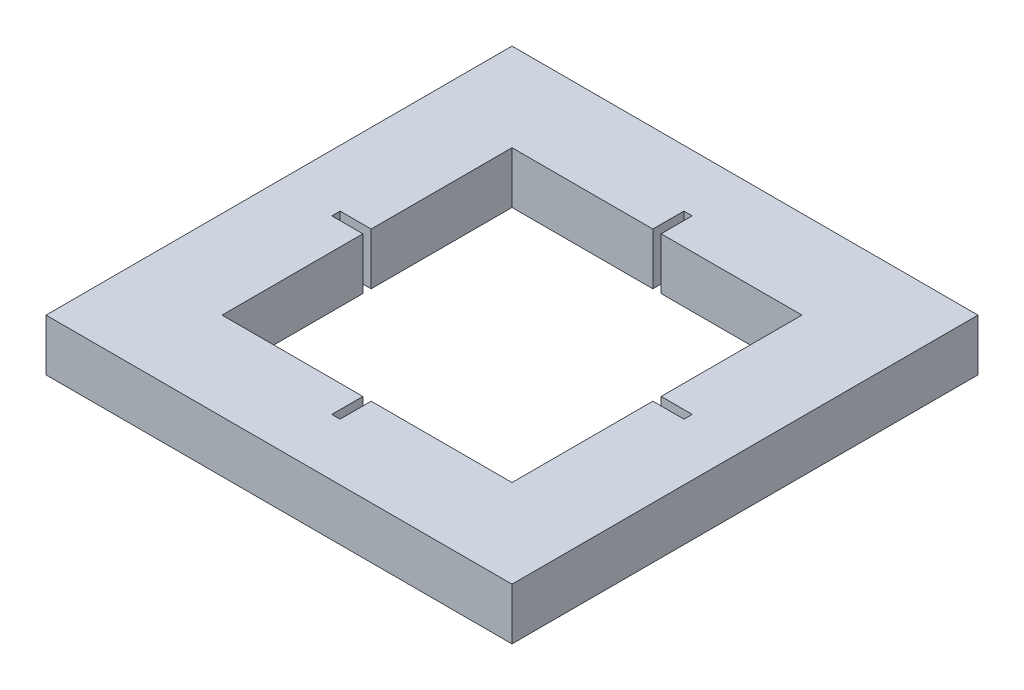
ISO-10303-21;
HEADER;
FILE_DESCRIPTION(('STEP AP214'),'2;1');
FILE_NAME('part.step','',(''),(''),'','','');
FILE_SCHEMA(('AUTOMOTIVE_DESIGN { 1 0 10303 214 1 1 1 1 }'));
ENDSEC;
DATA;
#1=APPLICATION_CONTEXT('core data for automotive mechanical design processes');
#2=APPLICATION_PROTOCOL_DEFINITION('international standard','automotive_design',2000,#1);
#3=PRODUCT_CONTEXT('',#1,'mechanical');
#4=PRODUCT('Part','Part','',(#3));
#5=PRODUCT_RELATED_PRODUCT_CATEGORY('part','',(#4));
#6=PRODUCT_DEFINITION_FORMATION('','',#4);
#7=PRODUCT_DEFINITION_CONTEXT('part definition',#1,'design');
#8=PRODUCT_DEFINITION('design','',#6,#7);
#9=PRODUCT_DEFINITION_SHAPE('','',#8);
#10=(LENGTH_UNIT() NAMED_UNIT(*) SI_UNIT(.MILLI.,.METRE.));
#11=(NAMED_UNIT(*) PLANE_ANGLE_UNIT() SI_UNIT($,.RADIAN.));
#12=(NAMED_UNIT(*) SI_UNIT($,.STERADIAN.) SOLID_ANGLE_UNIT());
#13=UNCERTAINTY_MEASURE_WITH_UNIT(LENGTH_MEASURE(1.E-05),#10,'distance_accuracy_value','');
#14=(GEOMETRIC_REPRESENTATION_CONTEXT(3) GLOBAL_UNCERTAINTY_ASSIGNED_CONTEXT((#13)) GLOBAL_UNIT_ASSIGNED_CONTEXT((#10,
#11,#12)) REPRESENTATION_CONTEXT('',''));
#15=CARTESIAN_POINT('',(0.,0.,0.));
#16=DIRECTION('',(0.,0.,1.));
#17=DIRECTION('',(1.,0.,0.));
#18=AXIS2_PLACEMENT_3D('',#15,#16,#17);
#19=CARTESIAN_POINT('',(36.5,5.,8.5));
#20=DIRECTION('',(-1.,0.,0.));
#21=DIRECTION('',(0.,0.,1.));
#22=AXIS2_PLACEMENT_3D('',#19,#20,#21);
#23=PLANE('',#22);
#24=DIRECTION('',(0.,-1.,0.));
#25=VECTOR('',#24,1.);
#26=CARTESIAN_POINT('',(36.5,5.,22.9));
#27=LINE('',#26,#25);
#28=CARTESIAN_POINT('',(36.5,5.,22.9));
#29=VERTEX_POINT('',#28);
#30=CARTESIAN_POINT('',(36.5,0.,22.9));
#31=VERTEX_POINT('',#30);
#32=EDGE_CURVE('E609',#29,#31,#27,.T.);
#33=ORIENTED_EDGE('',*,*,#32,.T.);
#34=DIRECTION('',(0.,0.,-1.));
#35=VECTOR('',#34,1.);
#36=CARTESIAN_POINT('',(36.5,0.,8.5));
#37=LINE('',#36,#35);
#38=CARTESIAN_POINT('',(36.5,0.,36.5));
#39=VERTEX_POINT('',#38);
#40=EDGE_CURVE('E232',#39,#31,#37,.T.);
#41=ORIENTED_EDGE('',*,*,#40,.F.);
#42=DIRECTION('',(0.,-1.,0.));
#43=VECTOR('',#42,1.);
#44=CARTESIAN_POINT('',(36.5,5.,36.5));
#45=LINE('',#44,#43);
#46=CARTESIAN_POINT('',(36.5,5.,36.5));
#47=VERTEX_POINT('',#46);
#48=EDGE_CURVE('E223',#47,#39,#45,.T.);
#49=ORIENTED_EDGE('',*,*,#48,.F.);
#50=DIRECTION('',(0.,0.,-1.));
#51=VECTOR('',#50,1.);
#52=CARTESIAN_POINT('',(36.5,5.,8.5));
#53=LINE('',#52,#51);
#54=EDGE_CURVE('E342',#47,#29,#53,.T.);
#55=ORIENTED_EDGE('',*,*,#54,.T.);
#56=EDGE_LOOP('',(#33,#41,#49,#55));
#57=FACE_BOUND('',#56,.T.);
#58=ADVANCED_FACE('F33',(#57),#23,.T.);
#59=CARTESIAN_POINT('',(8.49999999999999,5.,8.5));
#60=DIRECTION('',(0.,0.,1.));
#61=DIRECTION('',(1.,0.,0.));
#62=AXIS2_PLACEMENT_3D('',#59,#60,#61);
#63=PLANE('',#62);
#64=DIRECTION('',(0.,-1.,0.));
#65=VECTOR('',#64,1.);
#66=CARTESIAN_POINT('',(22.1,5.,8.49999999999999));
#67=LINE('',#66,#65);
#68=CARTESIAN_POINT('',(22.1,5.,8.49999999999999));
#69=VERTEX_POINT('',#68);
#70=CARTESIAN_POINT('',(22.1,0.,8.49999999999999));
#71=VERTEX_POINT('',#70);
#72=EDGE_CURVE('E355',#69,#71,#67,.T.);
#73=ORIENTED_EDGE('',*,*,#72,.F.);
#74=DIRECTION('',(-1.,0.,0.));
#75=VECTOR('',#74,1.);
#76=CARTESIAN_POINT('',(8.49999999999999,5.,8.5));
#77=LINE('',#76,#75);
#78=CARTESIAN_POINT('',(8.49999999999999,5.,8.5));
#79=VERTEX_POINT('',#78);
#80=EDGE_CURVE('E345',#69,#79,#77,.T.);
#81=ORIENTED_EDGE('',*,*,#80,.T.);
#82=DIRECTION('',(0.,-1.,0.));
#83=VECTOR('',#82,1.);
#84=CARTESIAN_POINT('',(8.49999999999999,5.,8.5));
#85=LINE('',#84,#83);
#86=CARTESIAN_POINT('',(8.49999999999999,0.,8.5));
#87=VERTEX_POINT('',#86);
#88=EDGE_CURVE('E249',#79,#87,#85,.T.);
#89=ORIENTED_EDGE('',*,*,#88,.T.);
#90=DIRECTION('',(-1.,0.,0.));
#91=VECTOR('',#90,1.);
#92=CARTESIAN_POINT('',(8.49999999999999,0.,8.5));
#93=LINE('',#92,#91);
#94=EDGE_CURVE('E235',#71,#87,#93,.T.);
#95=ORIENTED_EDGE('',*,*,#94,.F.);
#96=EDGE_LOOP('',(#73,#81,#89,#95));
#97=FACE_BOUND('',#96,.T.);
#98=ADVANCED_FACE('F306',(#97),#63,.T.);
#99=CARTESIAN_POINT('',(8.49999999999999,5.,8.5));
#100=DIRECTION('',(1.,0.,0.));
#101=DIRECTION('',(0.,0.,-1.));
#102=AXIS2_PLACEMENT_3D('',#99,#100,#101);
#103=PLANE('',#102);
#104=DIRECTION('',(0.,-1.,0.));
#105=VECTOR('',#104,1.);
#106=CARTESIAN_POINT('',(8.50000000000001,5.,22.1));
#107=LINE('',#106,#105);
#108=CARTESIAN_POINT('',(8.50000000000001,5.,22.1));
#109=VERTEX_POINT('',#108);
#110=CARTESIAN_POINT('',(8.50000000000001,0.,22.1));
#111=VERTEX_POINT('',#110);
#112=EDGE_CURVE('E383',#109,#111,#107,.T.);
#113=ORIENTED_EDGE('',*,*,#112,.T.);
#114=DIRECTION('',(0.,0.,1.));
#115=VECTOR('',#114,1.);
#116=CARTESIAN_POINT('',(8.49999999999999,0.,8.5));
#117=LINE('',#116,#115);
#118=EDGE_CURVE('E241',#87,#111,#117,.T.);
#119=ORIENTED_EDGE('',*,*,#118,.F.);
#120=ORIENTED_EDGE('',*,*,#88,.F.);
#121=DIRECTION('',(0.,0.,1.));
#122=VECTOR('',#121,1.);
#123=CARTESIAN_POINT('',(8.49999999999999,5.,8.5));
#124=LINE('',#123,#122);
#125=EDGE_CURVE('E228',#79,#109,#124,.T.);
#126=ORIENTED_EDGE('',*,*,#125,.T.);
#127=EDGE_LOOP('',(#113,#119,#120,#126));
#128=FACE_BOUND('',#127,.T.);
#129=ADVANCED_FACE('F313',(#128),#103,.T.);
#130=CARTESIAN_POINT('',(8.49999999999999,5.,36.5));
#131=DIRECTION('',(0.,0.,-1.));
#132=DIRECTION('',(-1.,0.,0.));
#133=AXIS2_PLACEMENT_3D('',#130,#131,#132);
#134=PLANE('',#133);
#135=DIRECTION('',(0.,-1.,0.));
#136=VECTOR('',#135,1.);
#137=CARTESIAN_POINT('',(22.1,5.,36.5));
#138=LINE('',#137,#136);
#139=CARTESIAN_POINT('',(22.1,5.,36.5));
#140=VERTEX_POINT('',#139);
#141=CARTESIAN_POINT('',(22.1,0.,36.5));
#142=VERTEX_POINT('',#141);
#143=EDGE_CURVE('E194',#140,#142,#138,.T.);
#144=ORIENTED_EDGE('',*,*,#143,.T.);
#145=DIRECTION('',(1.,0.,0.));
#146=VECTOR('',#145,1.);
#147=CARTESIAN_POINT('',(8.49999999999999,0.,36.5));
#148=LINE('',#147,#146);
#149=CARTESIAN_POINT('',(8.49999999999999,0.,36.5));
#150=VERTEX_POINT('',#149);
#151=EDGE_CURVE('E245',#150,#142,#148,.T.);
#152=ORIENTED_EDGE('',*,*,#151,.F.);
#153=DIRECTION('',(0.,-1.,0.));
#154=VECTOR('',#153,1.);
#155=CARTESIAN_POINT('',(8.49999999999999,5.,36.5));
#156=LINE('',#155,#154);
#157=CARTESIAN_POINT('',(8.49999999999999,5.,36.5));
#158=VERTEX_POINT('',#157);
#159=EDGE_CURVE('E222',#158,#150,#156,.T.);
#160=ORIENTED_EDGE('',*,*,#159,.F.);
#161=DIRECTION('',(1.,0.,0.));
#162=VECTOR('',#161,1.);
#163=CARTESIAN_POINT('',(8.49999999999999,5.,36.5));
#164=LINE('',#163,#162);
#165=EDGE_CURVE('E213',#158,#140,#164,.T.);
#166=ORIENTED_EDGE('',*,*,#165,.T.);
#167=EDGE_LOOP('',(#144,#152,#160,#166));
#168=FACE_BOUND('',#167,.T.);
#169=ADVANCED_FACE('F220',(#168),#134,.T.);
#170=CARTESIAN_POINT('',(0.,5.,0.));
#171=DIRECTION('',(0.,1.,0.));
#172=DIRECTION('',(0.,0.,1.));
#173=AXIS2_PLACEMENT_3D('',#170,#171,#172);
#174=PLANE('',#173);
#175=DIRECTION('',(0.,0.,-1.));
#176=VECTOR('',#175,1.);
#177=CARTESIAN_POINT('',(22.1,5.,36.5));
#178=LINE('',#177,#176);
#179=CARTESIAN_POINT('',(22.1,5.,39.5));
#180=VERTEX_POINT('',#179);
#181=EDGE_CURVE('E197',#180,#140,#178,.T.);
#182=ORIENTED_EDGE('',*,*,#181,.T.);
#183=ORIENTED_EDGE('',*,*,#165,.F.);
#184=CARTESIAN_POINT('',(8.49999999999999,5.,22.9));
#185=VERTEX_POINT('',#184);
#186=EDGE_CURVE('E349',#185,#158,#124,.T.);
#187=ORIENTED_EDGE('',*,*,#186,.F.);
#188=DIRECTION('',(-1.,0.,0.));
#189=VECTOR('',#188,1.);
#190=CARTESIAN_POINT('',(8.50000000000001,5.,22.9));
#191=LINE('',#190,#189);
#192=CARTESIAN_POINT('',(5.50000000000001,5.,22.9));
#193=VERTEX_POINT('',#192);
#194=EDGE_CURVE('E371',#185,#193,#191,.T.);
#195=ORIENTED_EDGE('',*,*,#194,.T.);
#196=DIRECTION('',(0.,0.,-1.));
#197=VECTOR('',#196,1.);
#198=CARTESIAN_POINT('',(5.50000000000001,5.,22.1));
#199=LINE('',#198,#197);
#200=CARTESIAN_POINT('',(5.50000000000001,5.,22.1));
#201=VERTEX_POINT('',#200);
#202=EDGE_CURVE('E367',#193,#201,#199,.T.);
#203=ORIENTED_EDGE('',*,*,#202,.T.);
#204=DIRECTION('',(1.,0.,0.));
#205=VECTOR('',#204,1.);
#206=CARTESIAN_POINT('',(8.50000000000001,5.,22.1));
#207=LINE('',#206,#205);
#208=EDGE_CURVE('E364',#201,#109,#207,.T.);
#209=ORIENTED_EDGE('',*,*,#208,.T.);
#210=ORIENTED_EDGE('',*,*,#125,.F.);
#211=ORIENTED_EDGE('',*,*,#80,.F.);
#212=DIRECTION('',(0.,0.,-1.));
#213=VECTOR('',#212,1.);
#214=CARTESIAN_POINT('',(22.1,5.,8.49999999999999));
#215=LINE('',#214,#213);
#216=CARTESIAN_POINT('',(22.1,5.,5.49999999999999));
#217=VERTEX_POINT('',#216);
#218=EDGE_CURVE('E614',#69,#217,#215,.T.);
#219=ORIENTED_EDGE('',*,*,#218,.T.);
#220=DIRECTION('',(1.,0.,0.));
#221=VECTOR('',#220,1.);
#222=CARTESIAN_POINT('',(22.1,5.,5.49999999999999));
#223=LINE('',#222,#221);
#224=CARTESIAN_POINT('',(22.9,5.,5.49999999999999));
#225=VERTEX_POINT('',#224);
#226=EDGE_CURVE('E616',#217,#225,#223,.T.);
#227=ORIENTED_EDGE('',*,*,#226,.T.);
#228=DIRECTION('',(0.,0.,1.));
#229=VECTOR('',#228,1.);
#230=CARTESIAN_POINT('',(22.9,5.,8.49999999999999));
#231=LINE('',#230,#229);
#232=CARTESIAN_POINT('',(22.9,5.,8.49999999999999));
#233=VERTEX_POINT('',#232);
#234=EDGE_CURVE('E619',#225,#233,#231,.T.);
#235=ORIENTED_EDGE('',*,*,#234,.T.);
#236=CARTESIAN_POINT('',(36.5,5.,8.5));
#237=VERTEX_POINT('',#236);
#238=EDGE_CURVE('E341',#237,#233,#77,.T.);
#239=ORIENTED_EDGE('',*,*,#238,.F.);
#240=CARTESIAN_POINT('',(36.5,5.,22.1));
#241=VERTEX_POINT('',#240);
#242=EDGE_CURVE('E246',#241,#237,#53,.T.);
#243=ORIENTED_EDGE('',*,*,#242,.F.);
#244=DIRECTION('',(1.,0.,0.));
#245=VECTOR('',#244,1.);
#246=CARTESIAN_POINT('',(36.5,5.,22.1));
#247=LINE('',#246,#245);
#248=CARTESIAN_POINT('',(39.5,5.,22.1));
#249=VERTEX_POINT('',#248);
#250=EDGE_CURVE('E48',#241,#249,#247,.T.);
#251=ORIENTED_EDGE('',*,*,#250,.T.);
#252=DIRECTION('',(0.,0.,1.));
#253=VECTOR('',#252,1.);
#254=CARTESIAN_POINT('',(39.5,5.,22.1));
#255=LINE('',#254,#253);
#256=CARTESIAN_POINT('',(39.5,5.,22.9));
#257=VERTEX_POINT('',#256);
#258=EDGE_CURVE('E650',#249,#257,#255,.T.);
#259=ORIENTED_EDGE('',*,*,#258,.T.);
#260=DIRECTION('',(-1.,0.,0.));
#261=VECTOR('',#260,1.);
#262=CARTESIAN_POINT('',(36.5,5.,22.9));
#263=LINE('',#262,#261);
#264=EDGE_CURVE('E335',#257,#29,#263,.T.);
#265=ORIENTED_EDGE('',*,*,#264,.T.);
#266=ORIENTED_EDGE('',*,*,#54,.F.);
#267=CARTESIAN_POINT('',(22.9,5.,36.5));
#268=VERTEX_POINT('',#267);
#269=EDGE_CURVE('E224',#268,#47,#164,.T.);
#270=ORIENTED_EDGE('',*,*,#269,.F.);
#271=DIRECTION('',(0.,0.,1.));
#272=VECTOR('',#271,1.);
#273=CARTESIAN_POINT('',(22.9,5.,36.5));
#274=LINE('',#273,#272);
#275=CARTESIAN_POINT('',(22.9,5.,39.5));
#276=VERTEX_POINT('',#275);
#277=EDGE_CURVE('E216',#268,#276,#274,.T.);
#278=ORIENTED_EDGE('',*,*,#277,.T.);
#279=DIRECTION('',(-1.,0.,0.));
#280=VECTOR('',#279,1.);
#281=CARTESIAN_POINT('',(22.1,5.,39.5));
#282=LINE('',#281,#280);
#283=EDGE_CURVE('E206',#276,#180,#282,.T.);
#284=ORIENTED_EDGE('',*,*,#283,.T.);
#285=EDGE_LOOP('',(#182,#183,#187,#195,#203,#209,#210,#211,#219,#227,#235,#239,#243,#251,#259,
#265,#266,#270,#278,#284));
#286=FACE_BOUND('',#285,.T.);
#287=DIRECTION('',(0.,0.,1.));
#288=VECTOR('',#287,1.);
#289=CARTESIAN_POINT('',(0.,5.,0.));
#290=LINE('',#289,#288);
#291=CARTESIAN_POINT('',(0.,5.,0.));
#292=VERTEX_POINT('',#291);
#293=CARTESIAN_POINT('',(0.,5.,45.));
#294=VERTEX_POINT('',#293);
#295=EDGE_CURVE('E256',#292,#294,#290,.T.);
#296=ORIENTED_EDGE('',*,*,#295,.T.);
#297=DIRECTION('',(1.,0.,0.));
#298=VECTOR('',#297,1.);
#299=CARTESIAN_POINT('',(0.,5.,45.));
#300=LINE('',#299,#298);
#301=CARTESIAN_POINT('',(45.,5.,45.));
#302=VERTEX_POINT('',#301);
#303=EDGE_CURVE('E259',#294,#302,#300,.T.);
#304=ORIENTED_EDGE('',*,*,#303,.T.);
#305=DIRECTION('',(0.,0.,-1.));
#306=VECTOR('',#305,1.);
#307=CARTESIAN_POINT('',(45.,5.,0.));
#308=LINE('',#307,#306);
#309=CARTESIAN_POINT('',(45.,5.,0.));
#310=VERTEX_POINT('',#309);
#311=EDGE_CURVE('E262',#302,#310,#308,.T.);
#312=ORIENTED_EDGE('',*,*,#311,.T.);
#313=DIRECTION('',(-1.,0.,0.));
#314=VECTOR('',#313,1.);
#315=CARTESIAN_POINT('',(0.,5.,0.));
#316=LINE('',#315,#314);
#317=EDGE_CURVE('E264',#310,#292,#316,.T.);
#318=ORIENTED_EDGE('',*,*,#317,.T.);
#319=EDGE_LOOP('',(#296,#304,#312,#318));
#320=FACE_BOUND('',#319,.T.);
#321=ADVANCED_FACE('F210',(#286,#320),#174,.T.);
#322=CARTESIAN_POINT('',(0.,0.,0.));
#323=DIRECTION('',(0.,1.,0.));
#324=DIRECTION('',(0.,0.,1.));
#325=AXIS2_PLACEMENT_3D('',#322,#323,#324);
#326=PLANE('',#325);
#327=DIRECTION('',(0.,0.,1.));
#328=VECTOR('',#327,1.);
#329=CARTESIAN_POINT('',(0.,0.,0.));
#330=LINE('',#329,#328);
#331=CARTESIAN_POINT('',(0.,0.,0.));
#332=VERTEX_POINT('',#331);
#333=CARTESIAN_POINT('',(0.,0.,45.));
#334=VERTEX_POINT('',#333);
#335=EDGE_CURVE('E255',#332,#334,#330,.T.);
#336=ORIENTED_EDGE('',*,*,#335,.F.);
#337=DIRECTION('',(-1.,0.,0.));
#338=VECTOR('',#337,1.);
#339=CARTESIAN_POINT('',(0.,0.,0.));
#340=LINE('',#339,#338);
#341=CARTESIAN_POINT('',(45.,0.,0.));
#342=VERTEX_POINT('',#341);
#343=EDGE_CURVE('E260',#342,#332,#340,.T.);
#344=ORIENTED_EDGE('',*,*,#343,.F.);
#345=DIRECTION('',(0.,0.,-1.));
#346=VECTOR('',#345,1.);
#347=CARTESIAN_POINT('',(45.,0.,0.));
#348=LINE('',#347,#346);
#349=CARTESIAN_POINT('',(45.,0.,45.));
#350=VERTEX_POINT('',#349);
#351=EDGE_CURVE('E271',#350,#342,#348,.T.);
#352=ORIENTED_EDGE('',*,*,#351,.F.);
#353=DIRECTION('',(1.,0.,0.));
#354=VECTOR('',#353,1.);
#355=CARTESIAN_POINT('',(0.,0.,45.));
#356=LINE('',#355,#354);
#357=EDGE_CURVE('E269',#334,#350,#356,.T.);
#358=ORIENTED_EDGE('',*,*,#357,.F.);
#359=EDGE_LOOP('',(#336,#344,#352,#358));
#360=FACE_BOUND('',#359,.T.);
#361=ORIENTED_EDGE('',*,*,#151,.T.);
#362=DIRECTION('',(0.,0.,-1.));
#363=VECTOR('',#362,1.);
#364=CARTESIAN_POINT('',(22.1,0.,36.5));
#365=LINE('',#364,#363);
#366=CARTESIAN_POINT('',(22.1,0.,39.5));
#367=VERTEX_POINT('',#366);
#368=EDGE_CURVE('E200',#367,#142,#365,.T.);
#369=ORIENTED_EDGE('',*,*,#368,.F.);
#370=DIRECTION('',(-1.,0.,0.));
#371=VECTOR('',#370,1.);
#372=CARTESIAN_POINT('',(22.1,0.,39.5));
#373=LINE('',#372,#371);
#374=CARTESIAN_POINT('',(22.9,0.,39.5));
#375=VERTEX_POINT('',#374);
#376=EDGE_CURVE('E217',#375,#367,#373,.T.);
#377=ORIENTED_EDGE('',*,*,#376,.F.);
#378=DIRECTION('',(0.,0.,1.));
#379=VECTOR('',#378,1.);
#380=CARTESIAN_POINT('',(22.9,0.,36.5));
#381=LINE('',#380,#379);
#382=CARTESIAN_POINT('',(22.9,0.,36.5));
#383=VERTEX_POINT('',#382);
#384=EDGE_CURVE('E636',#383,#375,#381,.T.);
#385=ORIENTED_EDGE('',*,*,#384,.F.);
#386=EDGE_CURVE('E244',#383,#39,#148,.T.);
#387=ORIENTED_EDGE('',*,*,#386,.T.);
#388=ORIENTED_EDGE('',*,*,#40,.T.);
#389=DIRECTION('',(-1.,0.,0.));
#390=VECTOR('',#389,1.);
#391=CARTESIAN_POINT('',(36.5,0.,22.9));
#392=LINE('',#391,#390);
#393=CARTESIAN_POINT('',(39.5,0.,22.9));
#394=VERTEX_POINT('',#393);
#395=EDGE_CURVE('E604',#394,#31,#392,.T.);
#396=ORIENTED_EDGE('',*,*,#395,.F.);
#397=DIRECTION('',(0.,0.,1.));
#398=VECTOR('',#397,1.);
#399=CARTESIAN_POINT('',(39.5,0.,22.1));
#400=LINE('',#399,#398);
#401=CARTESIAN_POINT('',(39.5,0.,22.1));
#402=VERTEX_POINT('',#401);
#403=EDGE_CURVE('E600',#402,#394,#400,.T.);
#404=ORIENTED_EDGE('',*,*,#403,.F.);
#405=DIRECTION('',(1.,0.,0.));
#406=VECTOR('',#405,1.);
#407=CARTESIAN_POINT('',(36.5,0.,22.1));
#408=LINE('',#407,#406);
#409=CARTESIAN_POINT('',(36.5,0.,22.1));
#410=VERTEX_POINT('',#409);
#411=EDGE_CURVE('E597',#410,#402,#408,.T.);
#412=ORIENTED_EDGE('',*,*,#411,.F.);
#413=CARTESIAN_POINT('',(36.5,0.,8.5));
#414=VERTEX_POINT('',#413);
#415=EDGE_CURVE('E236',#410,#414,#37,.T.);
#416=ORIENTED_EDGE('',*,*,#415,.T.);
#417=CARTESIAN_POINT('',(22.9,0.,8.5));
#418=VERTEX_POINT('',#417);
#419=EDGE_CURVE('E237',#414,#418,#93,.T.);
#420=ORIENTED_EDGE('',*,*,#419,.T.);
#421=DIRECTION('',(0.,0.,1.));
#422=VECTOR('',#421,1.);
#423=CARTESIAN_POINT('',(22.9,0.,8.49999999999999));
#424=LINE('',#423,#422);
#425=CARTESIAN_POINT('',(22.9,0.,5.49999999999999));
#426=VERTEX_POINT('',#425);
#427=EDGE_CURVE('E56',#426,#418,#424,.T.);
#428=ORIENTED_EDGE('',*,*,#427,.F.);
#429=DIRECTION('',(1.,0.,0.));
#430=VECTOR('',#429,1.);
#431=CARTESIAN_POINT('',(22.1,0.,5.49999999999999));
#432=LINE('',#431,#430);
#433=CARTESIAN_POINT('',(22.1,0.,5.49999999999999));
#434=VERTEX_POINT('',#433);
#435=EDGE_CURVE('E624',#434,#426,#432,.T.);
#436=ORIENTED_EDGE('',*,*,#435,.F.);
#437=DIRECTION('',(0.,0.,-1.));
#438=VECTOR('',#437,1.);
#439=CARTESIAN_POINT('',(22.1,0.,8.49999999999999));
#440=LINE('',#439,#438);
#441=EDGE_CURVE('E385',#71,#434,#440,.T.);
#442=ORIENTED_EDGE('',*,*,#441,.F.);
#443=ORIENTED_EDGE('',*,*,#94,.T.);
#444=ORIENTED_EDGE('',*,*,#118,.T.);
#445=DIRECTION('',(1.,0.,0.));
#446=VECTOR('',#445,1.);
#447=CARTESIAN_POINT('',(8.50000000000001,0.,22.1));
#448=LINE('',#447,#446);
#449=CARTESIAN_POINT('',(5.50000000000001,0.,22.1));
#450=VERTEX_POINT('',#449);
#451=EDGE_CURVE('E381',#450,#111,#448,.T.);
#452=ORIENTED_EDGE('',*,*,#451,.F.);
#453=DIRECTION('',(0.,0.,-1.));
#454=VECTOR('',#453,1.);
#455=CARTESIAN_POINT('',(5.50000000000001,0.,22.1));
#456=LINE('',#455,#454);
#457=CARTESIAN_POINT('',(5.50000000000001,0.,22.9));
#458=VERTEX_POINT('',#457);
#459=EDGE_CURVE('E378',#458,#450,#456,.T.);
#460=ORIENTED_EDGE('',*,*,#459,.F.);
#461=DIRECTION('',(-1.,0.,0.));
#462=VECTOR('',#461,1.);
#463=CARTESIAN_POINT('',(8.50000000000001,0.,22.9));
#464=LINE('',#463,#462);
#465=CARTESIAN_POINT('',(8.50000000000001,0.,22.9));
#466=VERTEX_POINT('',#465);
#467=EDGE_CURVE('E375',#466,#458,#464,.T.);
#468=ORIENTED_EDGE('',*,*,#467,.F.);
#469=EDGE_CURVE('E240',#466,#150,#117,.T.);
#470=ORIENTED_EDGE('',*,*,#469,.T.);
#471=EDGE_LOOP('',(#361,#369,#377,#385,#387,#388,#396,#404,#412,#416,#420,#428,#436,#442,#443,
#444,#452,#460,#468,#470));
#472=FACE_BOUND('',#471,.T.);
#473=ADVANCED_FACE('F289',(#360,#472),#326,.F.);
#474=CARTESIAN_POINT('',(0.,5.,0.));
#475=DIRECTION('',(1.,0.,0.));
#476=DIRECTION('',(0.,0.,-1.));
#477=AXIS2_PLACEMENT_3D('',#474,#475,#476);
#478=PLANE('',#477);
#479=ORIENTED_EDGE('',*,*,#335,.T.);
#480=DIRECTION('',(0.,-1.,0.));
#481=VECTOR('',#480,1.);
#482=CARTESIAN_POINT('',(0.,5.,45.));
#483=LINE('',#482,#481);
#484=EDGE_CURVE('E11',#294,#334,#483,.T.);
#485=ORIENTED_EDGE('',*,*,#484,.F.);
#486=ORIENTED_EDGE('',*,*,#295,.F.);
#487=DIRECTION('',(0.,-1.,0.));
#488=VECTOR('',#487,1.);
#489=CARTESIAN_POINT('',(0.,5.,0.));
#490=LINE('',#489,#488);
#491=EDGE_CURVE('E266',#292,#332,#490,.T.);
#492=ORIENTED_EDGE('',*,*,#491,.T.);
#493=EDGE_LOOP('',(#479,#485,#486,#492));
#494=FACE_BOUND('',#493,.T.);
#495=ADVANCED_FACE('F35',(#494),#478,.F.);
#496=CARTESIAN_POINT('',(0.,5.,45.));
#497=DIRECTION('',(0.,0.,-1.));
#498=DIRECTION('',(-1.,0.,0.));
#499=AXIS2_PLACEMENT_3D('',#496,#497,#498);
#500=PLANE('',#499);
#501=ORIENTED_EDGE('',*,*,#357,.T.);
#502=DIRECTION('',(0.,-1.,0.));
#503=VECTOR('',#502,1.);
#504=CARTESIAN_POINT('',(45.,5.,45.));
#505=LINE('',#504,#503);
#506=EDGE_CURVE('E41',#302,#350,#505,.T.);
#507=ORIENTED_EDGE('',*,*,#506,.F.);
#508=ORIENTED_EDGE('',*,*,#303,.F.);
#509=ORIENTED_EDGE('',*,*,#484,.T.);
#510=EDGE_LOOP('',(#501,#507,#508,#509));
#511=FACE_BOUND('',#510,.T.);
#512=ADVANCED_FACE('F298',(#511),#500,.F.);
#513=CARTESIAN_POINT('',(45.,5.,0.));
#514=DIRECTION('',(-1.,0.,0.));
#515=DIRECTION('',(0.,0.,1.));
#516=AXIS2_PLACEMENT_3D('',#513,#514,#515);
#517=PLANE('',#516);
#518=ORIENTED_EDGE('',*,*,#351,.T.);
#519=DIRECTION('',(0.,-1.,0.));
#520=VECTOR('',#519,1.);
#521=CARTESIAN_POINT('',(45.,5.,0.));
#522=LINE('',#521,#520);
#523=EDGE_CURVE('E276',#310,#342,#522,.T.);
#524=ORIENTED_EDGE('',*,*,#523,.F.);
#525=ORIENTED_EDGE('',*,*,#311,.F.);
#526=ORIENTED_EDGE('',*,*,#506,.T.);
#527=EDGE_LOOP('',(#518,#524,#525,#526));
#528=FACE_BOUND('',#527,.T.);
#529=ADVANCED_FACE('F283',(#528),#517,.F.);
#530=CARTESIAN_POINT('',(0.,5.,0.));
#531=DIRECTION('',(0.,0.,1.));
#532=DIRECTION('',(1.,0.,0.));
#533=AXIS2_PLACEMENT_3D('',#530,#531,#532);
#534=PLANE('',#533);
#535=ORIENTED_EDGE('',*,*,#343,.T.);
#536=ORIENTED_EDGE('',*,*,#491,.F.);
#537=ORIENTED_EDGE('',*,*,#317,.F.);
#538=ORIENTED_EDGE('',*,*,#523,.T.);
#539=EDGE_LOOP('',(#535,#536,#537,#538));
#540=FACE_BOUND('',#539,.T.);
#541=ADVANCED_FACE('F293',(#540),#534,.F.);
#542=DIRECTION('',(0.,-1.,0.));
#543=VECTOR('',#542,1.);
#544=CARTESIAN_POINT('',(36.5,5.,22.1));
#545=LINE('',#544,#543);
#546=EDGE_CURVE('E329',#241,#410,#545,.T.);
#547=ORIENTED_EDGE('',*,*,#546,.F.);
#548=ORIENTED_EDGE('',*,*,#242,.T.);
#549=DIRECTION('',(0.,-1.,0.));
#550=VECTOR('',#549,1.);
#551=CARTESIAN_POINT('',(36.5,5.,8.5));
#552=LINE('',#551,#550);
#553=EDGE_CURVE('E252',#237,#414,#552,.T.);
#554=ORIENTED_EDGE('',*,*,#553,.T.);
#555=ORIENTED_EDGE('',*,*,#415,.F.);
#556=EDGE_LOOP('',(#547,#548,#554,#555));
#557=FACE_BOUND('',#556,.T.);
#558=ADVANCED_FACE('F309',(#557),#23,.T.);
#559=DIRECTION('',(0.,-1.,0.));
#560=VECTOR('',#559,1.);
#561=CARTESIAN_POINT('',(22.9,5.,8.49999999999999));
#562=LINE('',#561,#560);
#563=EDGE_CURVE('E629',#233,#418,#562,.T.);
#564=ORIENTED_EDGE('',*,*,#563,.T.);
#565=ORIENTED_EDGE('',*,*,#419,.F.);
#566=ORIENTED_EDGE('',*,*,#553,.F.);
#567=ORIENTED_EDGE('',*,*,#238,.T.);
#568=EDGE_LOOP('',(#564,#565,#566,#567));
#569=FACE_BOUND('',#568,.T.);
#570=ADVANCED_FACE('F316',(#569),#63,.T.);
#571=DIRECTION('',(0.,-1.,0.));
#572=VECTOR('',#571,1.);
#573=CARTESIAN_POINT('',(8.50000000000001,5.,22.9));
#574=LINE('',#573,#572);
#575=EDGE_CURVE('E347',#185,#466,#574,.T.);
#576=ORIENTED_EDGE('',*,*,#575,.F.);
#577=ORIENTED_EDGE('',*,*,#186,.T.);
#578=ORIENTED_EDGE('',*,*,#159,.T.);
#579=ORIENTED_EDGE('',*,*,#469,.F.);
#580=EDGE_LOOP('',(#576,#577,#578,#579));
#581=FACE_BOUND('',#580,.T.);
#582=ADVANCED_FACE('F325',(#581),#103,.T.);
#583=DIRECTION('',(0.,-1.,0.));
#584=VECTOR('',#583,1.);
#585=CARTESIAN_POINT('',(22.9,5.,36.5));
#586=LINE('',#585,#584);
#587=EDGE_CURVE('E205',#268,#383,#586,.T.);
#588=ORIENTED_EDGE('',*,*,#587,.F.);
#589=ORIENTED_EDGE('',*,*,#269,.T.);
#590=ORIENTED_EDGE('',*,*,#48,.T.);
#591=ORIENTED_EDGE('',*,*,#386,.F.);
#592=EDGE_LOOP('',(#588,#589,#590,#591));
#593=FACE_BOUND('',#592,.T.);
#594=ADVANCED_FACE('F414',(#593),#134,.T.);
#595=CARTESIAN_POINT('',(22.1,5.,36.5));
#596=DIRECTION('',(-1.,0.,0.));
#597=DIRECTION('',(0.,0.,1.));
#598=AXIS2_PLACEMENT_3D('',#595,#596,#597);
#599=PLANE('',#598);
#600=ORIENTED_EDGE('',*,*,#368,.T.);
#601=ORIENTED_EDGE('',*,*,#143,.F.);
#602=ORIENTED_EDGE('',*,*,#181,.F.);
#603=DIRECTION('',(0.,-1.,0.));
#604=VECTOR('',#603,1.);
#605=CARTESIAN_POINT('',(22.1,5.,39.5));
#606=LINE('',#605,#604);
#607=EDGE_CURVE('E644',#180,#367,#606,.T.);
#608=ORIENTED_EDGE('',*,*,#607,.T.);
#609=EDGE_LOOP('',(#600,#601,#602,#608));
#610=FACE_BOUND('',#609,.T.);
#611=ADVANCED_FACE('F196',(#610),#599,.F.);
#612=CARTESIAN_POINT('',(22.1,5.,39.5));
#613=DIRECTION('',(0.,0.,1.));
#614=DIRECTION('',(1.,0.,0.));
#615=AXIS2_PLACEMENT_3D('',#612,#613,#614);
#616=PLANE('',#615);
#617=ORIENTED_EDGE('',*,*,#376,.T.);
#618=ORIENTED_EDGE('',*,*,#607,.F.);
#619=ORIENTED_EDGE('',*,*,#283,.F.);
#620=DIRECTION('',(0.,-1.,0.));
#621=VECTOR('',#620,1.);
#622=CARTESIAN_POINT('',(22.9,5.,39.5));
#623=LINE('',#622,#621);
#624=EDGE_CURVE('E646',#276,#375,#623,.T.);
#625=ORIENTED_EDGE('',*,*,#624,.T.);
#626=EDGE_LOOP('',(#617,#618,#619,#625));
#627=FACE_BOUND('',#626,.T.);
#628=ADVANCED_FACE('F405',(#627),#616,.F.);
#629=CARTESIAN_POINT('',(22.9,5.,36.5));
#630=DIRECTION('',(1.,0.,0.));
#631=DIRECTION('',(0.,0.,-1.));
#632=AXIS2_PLACEMENT_3D('',#629,#630,#631);
#633=PLANE('',#632);
#634=ORIENTED_EDGE('',*,*,#384,.T.);
#635=ORIENTED_EDGE('',*,*,#624,.F.);
#636=ORIENTED_EDGE('',*,*,#277,.F.);
#637=ORIENTED_EDGE('',*,*,#587,.T.);
#638=EDGE_LOOP('',(#634,#635,#636,#637));
#639=FACE_BOUND('',#638,.T.);
#640=ADVANCED_FACE('F398',(#639),#633,.F.);
#641=CARTESIAN_POINT('',(8.50000000000001,5.,22.1));
#642=DIRECTION('',(0.,0.,-1.));
#643=DIRECTION('',(-1.,0.,0.));
#644=AXIS2_PLACEMENT_3D('',#641,#642,#643);
#645=PLANE('',#644);
#646=ORIENTED_EDGE('',*,*,#451,.T.);
#647=ORIENTED_EDGE('',*,*,#112,.F.);
#648=ORIENTED_EDGE('',*,*,#208,.F.);
#649=DIRECTION('',(0.,-1.,0.));
#650=VECTOR('',#649,1.);
#651=CARTESIAN_POINT('',(5.50000000000001,5.,22.1));
#652=LINE('',#651,#650);
#653=EDGE_CURVE('E386',#201,#450,#652,.T.);
#654=ORIENTED_EDGE('',*,*,#653,.T.);
#655=EDGE_LOOP('',(#646,#647,#648,#654));
#656=FACE_BOUND('',#655,.T.);
#657=ADVANCED_FACE('F396',(#656),#645,.F.);
#658=CARTESIAN_POINT('',(5.50000000000001,5.,22.1));
#659=DIRECTION('',(-1.,0.,0.));
#660=DIRECTION('',(0.,0.,1.));
#661=AXIS2_PLACEMENT_3D('',#658,#659,#660);
#662=PLANE('',#661);
#663=ORIENTED_EDGE('',*,*,#459,.T.);
#664=ORIENTED_EDGE('',*,*,#653,.F.);
#665=ORIENTED_EDGE('',*,*,#202,.F.);
#666=DIRECTION('',(0.,-1.,0.));
#667=VECTOR('',#666,1.);
#668=CARTESIAN_POINT('',(5.50000000000001,5.,22.9));
#669=LINE('',#668,#667);
#670=EDGE_CURVE('E370',#193,#458,#669,.T.);
#671=ORIENTED_EDGE('',*,*,#670,.T.);
#672=EDGE_LOOP('',(#663,#664,#665,#671));
#673=FACE_BOUND('',#672,.T.);
#674=ADVANCED_FACE('F388',(#673),#662,.F.);
#675=CARTESIAN_POINT('',(8.50000000000001,5.,22.9));
#676=DIRECTION('',(0.,0.,1.));
#677=DIRECTION('',(1.,0.,0.));
#678=AXIS2_PLACEMENT_3D('',#675,#676,#677);
#679=PLANE('',#678);
#680=ORIENTED_EDGE('',*,*,#467,.T.);
#681=ORIENTED_EDGE('',*,*,#670,.F.);
#682=ORIENTED_EDGE('',*,*,#194,.F.);
#683=ORIENTED_EDGE('',*,*,#575,.T.);
#684=EDGE_LOOP('',(#680,#681,#682,#683));
#685=FACE_BOUND('',#684,.T.);
#686=ADVANCED_FACE('F393',(#685),#679,.F.);
#687=CARTESIAN_POINT('',(22.1,5.,8.49999999999999));
#688=DIRECTION('',(-1.,0.,0.));
#689=DIRECTION('',(0.,0.,1.));
#690=AXIS2_PLACEMENT_3D('',#687,#688,#689);
#691=PLANE('',#690);
#692=ORIENTED_EDGE('',*,*,#441,.T.);
#693=DIRECTION('',(0.,-1.,0.));
#694=VECTOR('',#693,1.);
#695=CARTESIAN_POINT('',(22.1,5.,5.49999999999999));
#696=LINE('',#695,#694);
#697=EDGE_CURVE('E621',#217,#434,#696,.T.);
#698=ORIENTED_EDGE('',*,*,#697,.F.);
#699=ORIENTED_EDGE('',*,*,#218,.F.);
#700=ORIENTED_EDGE('',*,*,#72,.T.);
#701=EDGE_LOOP('',(#692,#698,#699,#700));
#702=FACE_BOUND('',#701,.T.);
#703=ADVANCED_FACE('F409',(#702),#691,.F.);
#704=CARTESIAN_POINT('',(22.9,5.,8.49999999999999));
#705=DIRECTION('',(1.,0.,0.));
#706=DIRECTION('',(0.,0.,-1.));
#707=AXIS2_PLACEMENT_3D('',#704,#705,#706);
#708=PLANE('',#707);
#709=ORIENTED_EDGE('',*,*,#427,.T.);
#710=ORIENTED_EDGE('',*,*,#563,.F.);
#711=ORIENTED_EDGE('',*,*,#234,.F.);
#712=DIRECTION('',(0.,-1.,0.));
#713=VECTOR('',#712,1.);
#714=CARTESIAN_POINT('',(22.9,5.,5.49999999999999));
#715=LINE('',#714,#713);
#716=EDGE_CURVE('E631',#225,#426,#715,.T.);
#717=ORIENTED_EDGE('',*,*,#716,.T.);
#718=EDGE_LOOP('',(#709,#710,#711,#717));
#719=FACE_BOUND('',#718,.T.);
#720=ADVANCED_FACE('F547',(#719),#708,.F.);
#721=CARTESIAN_POINT('',(22.1,5.,5.49999999999999));
#722=DIRECTION('',(0.,0.,-1.));
#723=DIRECTION('',(-1.,0.,0.));
#724=AXIS2_PLACEMENT_3D('',#721,#722,#723);
#725=PLANE('',#724);
#726=ORIENTED_EDGE('',*,*,#435,.T.);
#727=ORIENTED_EDGE('',*,*,#716,.F.);
#728=ORIENTED_EDGE('',*,*,#226,.F.);
#729=ORIENTED_EDGE('',*,*,#697,.T.);
#730=EDGE_LOOP('',(#726,#727,#728,#729));
#731=FACE_BOUND('',#730,.T.);
#732=ADVANCED_FACE('F556',(#731),#725,.F.);
#733=CARTESIAN_POINT('',(36.5,5.,22.9));
#734=DIRECTION('',(0.,0.,1.));
#735=DIRECTION('',(1.,0.,0.));
#736=AXIS2_PLACEMENT_3D('',#733,#734,#735);
#737=PLANE('',#736);
#738=ORIENTED_EDGE('',*,*,#395,.T.);
#739=ORIENTED_EDGE('',*,*,#32,.F.);
#740=ORIENTED_EDGE('',*,*,#264,.F.);
#741=DIRECTION('',(0.,-1.,0.));
#742=VECTOR('',#741,1.);
#743=CARTESIAN_POINT('',(39.5,5.,22.9));
#744=LINE('',#743,#742);
#745=EDGE_CURVE('E611',#257,#394,#744,.T.);
#746=ORIENTED_EDGE('',*,*,#745,.T.);
#747=EDGE_LOOP('',(#738,#739,#740,#746));
#748=FACE_BOUND('',#747,.T.);
#749=ADVANCED_FACE('F565',(#748),#737,.F.);
#750=CARTESIAN_POINT('',(39.5,5.,22.1));
#751=DIRECTION('',(1.,0.,0.));
#752=DIRECTION('',(0.,0.,-1.));
#753=AXIS2_PLACEMENT_3D('',#750,#751,#752);
#754=PLANE('',#753);
#755=ORIENTED_EDGE('',*,*,#403,.T.);
#756=ORIENTED_EDGE('',*,*,#745,.F.);
#757=ORIENTED_EDGE('',*,*,#258,.F.);
#758=DIRECTION('',(0.,-1.,0.));
#759=VECTOR('',#758,1.);
#760=CARTESIAN_POINT('',(39.5,5.,22.1));
#761=LINE('',#760,#759);
#762=EDGE_CURVE('E334',#249,#402,#761,.T.);
#763=ORIENTED_EDGE('',*,*,#762,.T.);
#764=EDGE_LOOP('',(#755,#756,#757,#763));
#765=FACE_BOUND('',#764,.T.);
#766=ADVANCED_FACE('F574',(#765),#754,.F.);
#767=CARTESIAN_POINT('',(36.5,5.,22.1));
#768=DIRECTION('',(0.,0.,-1.));
#769=DIRECTION('',(-1.,0.,0.));
#770=AXIS2_PLACEMENT_3D('',#767,#768,#769);
#771=PLANE('',#770);
#772=ORIENTED_EDGE('',*,*,#411,.T.);
#773=ORIENTED_EDGE('',*,*,#762,.F.);
#774=ORIENTED_EDGE('',*,*,#250,.F.);
#775=ORIENTED_EDGE('',*,*,#546,.T.);
#776=EDGE_LOOP('',(#772,#773,#774,#775));
#777=FACE_BOUND('',#776,.T.);
#778=ADVANCED_FACE('F584',(#777),#771,.F.);
#779=CLOSED_SHELL('',(#58,#98,#129,#169,#321,#473,#495,#512,#529,#541,#558,#570,#582,#594,#611,
#628,#640,#657,#674,#686,#703,#720,#732,#749,#766,#778));
#780=MANIFOLD_SOLID_BREP('B2',#779);
#781=ADVANCED_BREP_SHAPE_REPRESENTATION('',(#18,#780),#14);
#782=SHAPE_DEFINITION_REPRESENTATION(#9,#781);
ENDSEC;
END-ISO-10303-21;
